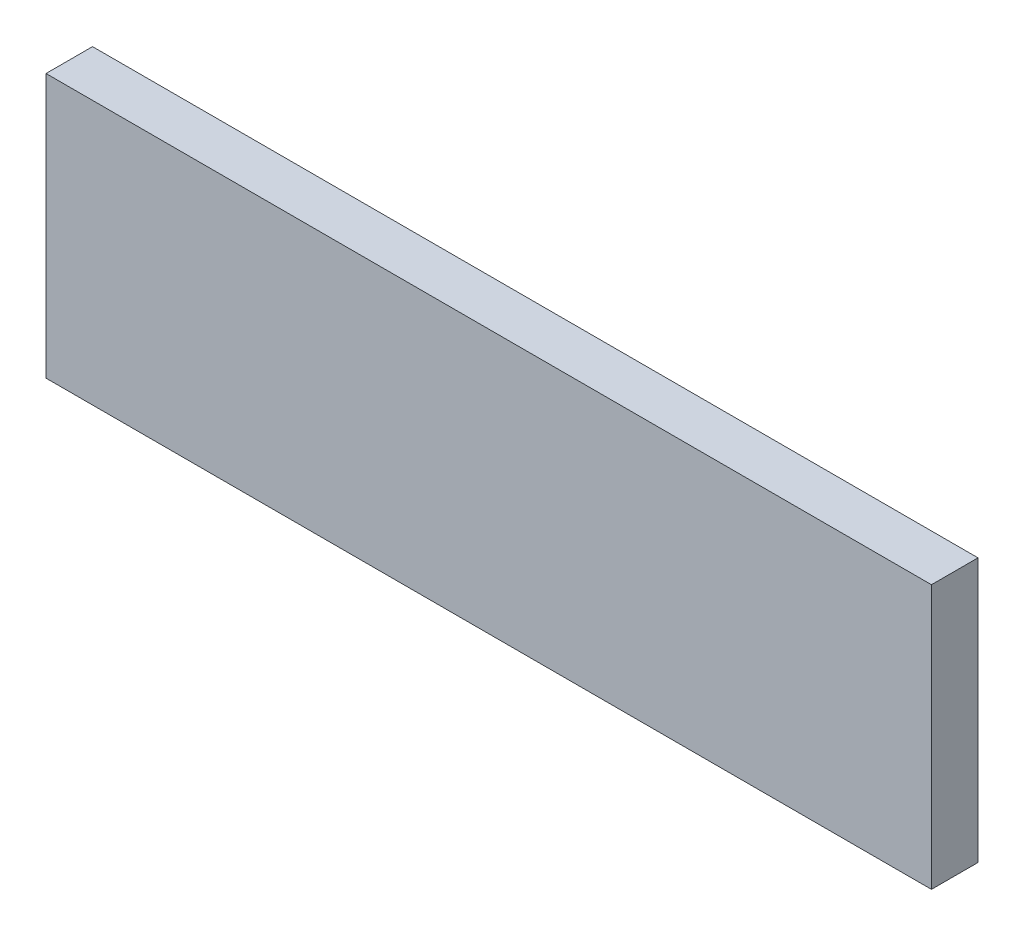
ISO-10303-21;
HEADER;
FILE_DESCRIPTION(('STEP AP214'),'2;1');
FILE_NAME('part.step','',(''),(''),'','','');
FILE_SCHEMA(('AUTOMOTIVE_DESIGN { 1 0 10303 214 1 1 1 1 }'));
ENDSEC;
DATA;
#1=APPLICATION_CONTEXT('core data for automotive mechanical design processes');
#2=APPLICATION_PROTOCOL_DEFINITION('international standard','automotive_design',2000,#1);
#3=PRODUCT_CONTEXT('',#1,'mechanical');
#4=PRODUCT('Part','Part','',(#3));
#5=PRODUCT_RELATED_PRODUCT_CATEGORY('part','',(#4));
#6=PRODUCT_DEFINITION_FORMATION('','',#4);
#7=PRODUCT_DEFINITION_CONTEXT('part definition',#1,'design');
#8=PRODUCT_DEFINITION('design','',#6,#7);
#9=PRODUCT_DEFINITION_SHAPE('','',#8);
#10=(LENGTH_UNIT() NAMED_UNIT(*) SI_UNIT(.MILLI.,.METRE.));
#11=(NAMED_UNIT(*) PLANE_ANGLE_UNIT() SI_UNIT($,.RADIAN.));
#12=(NAMED_UNIT(*) SI_UNIT($,.STERADIAN.) SOLID_ANGLE_UNIT());
#13=UNCERTAINTY_MEASURE_WITH_UNIT(LENGTH_MEASURE(1.E-05),#10,'distance_accuracy_value','');
#14=(GEOMETRIC_REPRESENTATION_CONTEXT(3) GLOBAL_UNCERTAINTY_ASSIGNED_CONTEXT((#13)) GLOBAL_UNIT_ASSIGNED_CONTEXT((#10,
#11,#12)) REPRESENTATION_CONTEXT('',''));
#15=CARTESIAN_POINT('',(0.,0.,0.));
#16=DIRECTION('',(0.,0.,1.));
#17=DIRECTION('',(1.,0.,0.));
#18=AXIS2_PLACEMENT_3D('',#15,#16,#17);
#19=CARTESIAN_POINT('',(0.0127,0.0178,1.));
#20=DIRECTION('',(1.,0.,0.));
#21=DIRECTION('',(0.,0.,-1.));
#22=AXIS2_PLACEMENT_3D('',#19,#20,#21);
#23=PLANE('',#22);
#24=DIRECTION('',(0.,-1.,0.));
#25=VECTOR('',#24,1.);
#26=CARTESIAN_POINT('',(0.0127,0.0178,0.));
#27=LINE('',#26,#25);
#28=CARTESIAN_POINT('',(0.0127,5.6871,0.));
#29=VERTEX_POINT('',#28);
#30=CARTESIAN_POINT('',(0.0127,0.0178,0.));
#31=VERTEX_POINT('',#30);
#32=EDGE_CURVE('E95',#29,#31,#27,.T.);
#33=ORIENTED_EDGE('',*,*,#32,.T.);
#34=DIRECTION('',(0.,0.,-1.));
#35=VECTOR('',#34,1.);
#36=CARTESIAN_POINT('',(0.0127,0.0178,1.));
#37=LINE('',#36,#35);
#38=CARTESIAN_POINT('',(0.0127,0.0178,1.));
#39=VERTEX_POINT('',#38);
#40=EDGE_CURVE('E11',#39,#31,#37,.T.);
#41=ORIENTED_EDGE('',*,*,#40,.F.);
#42=DIRECTION('',(0.,-1.,0.));
#43=VECTOR('',#42,1.);
#44=CARTESIAN_POINT('',(0.0127,0.0178,1.));
#45=LINE('',#44,#43);
#46=CARTESIAN_POINT('',(0.0127,5.6871,1.));
#47=VERTEX_POINT('',#46);
#48=EDGE_CURVE('E83',#47,#39,#45,.T.);
#49=ORIENTED_EDGE('',*,*,#48,.F.);
#50=DIRECTION('',(0.,0.,-1.));
#51=VECTOR('',#50,1.);
#52=CARTESIAN_POINT('',(0.0127,5.6871,1.));
#53=LINE('',#52,#51);
#54=EDGE_CURVE('E91',#47,#29,#53,.T.);
#55=ORIENTED_EDGE('',*,*,#54,.T.);
#56=EDGE_LOOP('',(#33,#41,#49,#55));
#57=FACE_BOUND('',#56,.T.);
#58=ADVANCED_FACE('F32',(#57),#23,.F.);
#59=CARTESIAN_POINT('',(19.0373,0.0178,1.));
#60=DIRECTION('',(0.,1.,0.));
#61=DIRECTION('',(0.,0.,1.));
#62=AXIS2_PLACEMENT_3D('',#59,#60,#61);
#63=PLANE('',#62);
#64=DIRECTION('',(1.,0.,0.));
#65=VECTOR('',#64,1.);
#66=CARTESIAN_POINT('',(19.0373,0.0178,0.));
#67=LINE('',#66,#65);
#68=CARTESIAN_POINT('',(19.0373,0.0178,0.));
#69=VERTEX_POINT('',#68);
#70=EDGE_CURVE('E87',#31,#69,#67,.T.);
#71=ORIENTED_EDGE('',*,*,#70,.T.);
#72=DIRECTION('',(0.,0.,-1.));
#73=VECTOR('',#72,1.);
#74=CARTESIAN_POINT('',(19.0373,0.0178,1.));
#75=LINE('',#74,#73);
#76=CARTESIAN_POINT('',(19.0373,0.0178,1.));
#77=VERTEX_POINT('',#76);
#78=EDGE_CURVE('E40',#77,#69,#75,.T.);
#79=ORIENTED_EDGE('',*,*,#78,.F.);
#80=DIRECTION('',(1.,0.,0.));
#81=VECTOR('',#80,1.);
#82=CARTESIAN_POINT('',(19.0373,0.0178,1.));
#83=LINE('',#82,#81);
#84=EDGE_CURVE('E78',#39,#77,#83,.T.);
#85=ORIENTED_EDGE('',*,*,#84,.F.);
#86=ORIENTED_EDGE('',*,*,#40,.T.);
#87=EDGE_LOOP('',(#71,#79,#85,#86));
#88=FACE_BOUND('',#87,.T.);
#89=ADVANCED_FACE('F86',(#88),#63,.F.);
#90=CARTESIAN_POINT('',(19.0373,5.6871,1.));
#91=DIRECTION('',(-1.,0.,0.));
#92=DIRECTION('',(0.,0.,1.));
#93=AXIS2_PLACEMENT_3D('',#90,#91,#92);
#94=PLANE('',#93);
#95=DIRECTION('',(0.,1.,0.));
#96=VECTOR('',#95,1.);
#97=CARTESIAN_POINT('',(19.0373,5.6871,0.));
#98=LINE('',#97,#96);
#99=CARTESIAN_POINT('',(19.0373,5.6871,0.));
#100=VERTEX_POINT('',#99);
#101=EDGE_CURVE('E65',#69,#100,#98,.T.);
#102=ORIENTED_EDGE('',*,*,#101,.T.);
#103=DIRECTION('',(0.,0.,-1.));
#104=VECTOR('',#103,1.);
#105=CARTESIAN_POINT('',(19.0373,5.6871,1.));
#106=LINE('',#105,#104);
#107=CARTESIAN_POINT('',(19.0373,5.6871,1.));
#108=VERTEX_POINT('',#107);
#109=EDGE_CURVE('E88',#108,#100,#106,.T.);
#110=ORIENTED_EDGE('',*,*,#109,.F.);
#111=DIRECTION('',(0.,1.,0.));
#112=VECTOR('',#111,1.);
#113=CARTESIAN_POINT('',(19.0373,5.6871,1.));
#114=LINE('',#113,#112);
#115=EDGE_CURVE('E81',#77,#108,#114,.T.);
#116=ORIENTED_EDGE('',*,*,#115,.F.);
#117=ORIENTED_EDGE('',*,*,#78,.T.);
#118=EDGE_LOOP('',(#102,#110,#116,#117));
#119=FACE_BOUND('',#118,.T.);
#120=ADVANCED_FACE('F89',(#119),#94,.F.);
#121=CARTESIAN_POINT('',(0.0127,5.6871,1.));
#122=DIRECTION('',(0.,-1.,0.));
#123=DIRECTION('',(0.,0.,-1.));
#124=AXIS2_PLACEMENT_3D('',#121,#122,#123);
#125=PLANE('',#124);
#126=DIRECTION('',(-1.,0.,0.));
#127=VECTOR('',#126,1.);
#128=CARTESIAN_POINT('',(0.0127,5.6871,0.));
#129=LINE('',#128,#127);
#130=EDGE_CURVE('E71',#100,#29,#129,.T.);
#131=ORIENTED_EDGE('',*,*,#130,.T.);
#132=ORIENTED_EDGE('',*,*,#54,.F.);
#133=DIRECTION('',(-1.,0.,0.));
#134=VECTOR('',#133,1.);
#135=CARTESIAN_POINT('',(0.0127,5.6871,1.));
#136=LINE('',#135,#134);
#137=EDGE_CURVE('E48',#108,#47,#136,.T.);
#138=ORIENTED_EDGE('',*,*,#137,.F.);
#139=ORIENTED_EDGE('',*,*,#109,.T.);
#140=EDGE_LOOP('',(#131,#132,#138,#139));
#141=FACE_BOUND('',#140,.T.);
#142=ADVANCED_FACE('F102',(#141),#125,.F.);
#143=CARTESIAN_POINT('',(0.,0.,1.));
#144=DIRECTION('',(0.,0.,-1.));
#145=DIRECTION('',(-1.,0.,0.));
#146=AXIS2_PLACEMENT_3D('',#143,#144,#145);
#147=PLANE('',#146);
#148=ORIENTED_EDGE('',*,*,#48,.T.);
#149=ORIENTED_EDGE('',*,*,#84,.T.);
#150=ORIENTED_EDGE('',*,*,#115,.T.);
#151=ORIENTED_EDGE('',*,*,#137,.T.);
#152=EDGE_LOOP('',(#148,#149,#150,#151));
#153=FACE_BOUND('',#152,.T.);
#154=ADVANCED_FACE('F79',(#153),#147,.F.);
#155=CARTESIAN_POINT('',(0.,0.,0.));
#156=DIRECTION('',(0.,0.,-1.));
#157=DIRECTION('',(-1.,0.,0.));
#158=AXIS2_PLACEMENT_3D('',#155,#156,#157);
#159=PLANE('',#158);
#160=ORIENTED_EDGE('',*,*,#32,.F.);
#161=ORIENTED_EDGE('',*,*,#130,.F.);
#162=ORIENTED_EDGE('',*,*,#101,.F.);
#163=ORIENTED_EDGE('',*,*,#70,.F.);
#164=EDGE_LOOP('',(#160,#161,#162,#163));
#165=FACE_BOUND('',#164,.T.);
#166=ADVANCED_FACE('F105',(#165),#159,.T.);
#167=CLOSED_SHELL('',(#58,#89,#120,#142,#154,#166));
#168=MANIFOLD_SOLID_BREP('B2',#167);
#169=ADVANCED_BREP_SHAPE_REPRESENTATION('',(#18,#168),#14);
#170=SHAPE_DEFINITION_REPRESENTATION(#9,#169);
ENDSEC;
END-ISO-10303-21;
